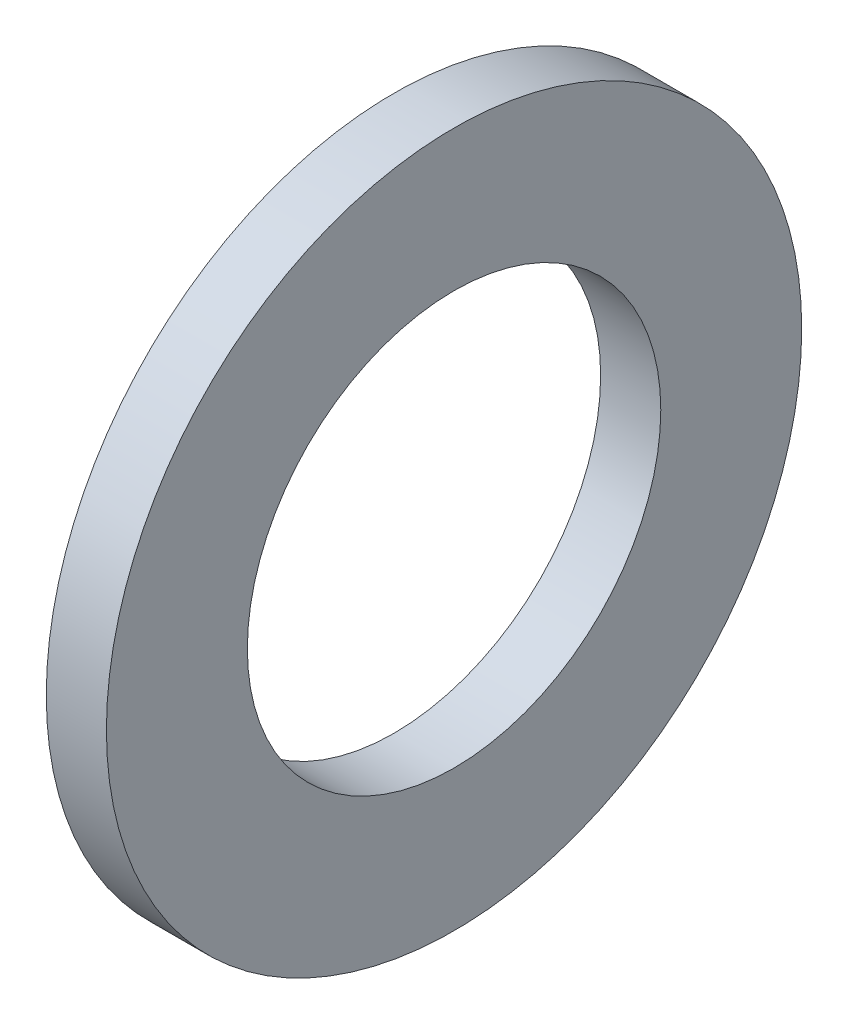
ISO-10303-21;
HEADER;
FILE_DESCRIPTION(('STEP AP214'),'2;1');
FILE_NAME('part.step','',(''),(''),'','','');
FILE_SCHEMA(('AUTOMOTIVE_DESIGN { 1 0 10303 214 1 1 1 1 }'));
ENDSEC;
DATA;
#1=APPLICATION_CONTEXT('core data for automotive mechanical design processes');
#2=APPLICATION_PROTOCOL_DEFINITION('international standard','automotive_design',2000,#1);
#3=PRODUCT_CONTEXT('',#1,'mechanical');
#4=PRODUCT('Part','Part','',(#3));
#5=PRODUCT_RELATED_PRODUCT_CATEGORY('part','',(#4));
#6=PRODUCT_DEFINITION_FORMATION('','',#4);
#7=PRODUCT_DEFINITION_CONTEXT('part definition',#1,'design');
#8=PRODUCT_DEFINITION('design','',#6,#7);
#9=PRODUCT_DEFINITION_SHAPE('','',#8);
#10=(LENGTH_UNIT() NAMED_UNIT(*) SI_UNIT(.MILLI.,.METRE.));
#11=(NAMED_UNIT(*) PLANE_ANGLE_UNIT() SI_UNIT($,.RADIAN.));
#12=(NAMED_UNIT(*) SI_UNIT($,.STERADIAN.) SOLID_ANGLE_UNIT());
#13=UNCERTAINTY_MEASURE_WITH_UNIT(LENGTH_MEASURE(1.E-05),#10,'distance_accuracy_value','');
#14=(GEOMETRIC_REPRESENTATION_CONTEXT(3) GLOBAL_UNCERTAINTY_ASSIGNED_CONTEXT((#13)) GLOBAL_UNIT_ASSIGNED_CONTEXT((#10,
#11,#12)) REPRESENTATION_CONTEXT('',''));
#15=CARTESIAN_POINT('',(0.,0.,0.));
#16=DIRECTION('',(0.,0.,1.));
#17=DIRECTION('',(1.,0.,0.));
#18=AXIS2_PLACEMENT_3D('',#15,#16,#17);
#19=CARTESIAN_POINT('',(-34.9249999999999,0.,0.));
#20=DIRECTION('',(-1.,0.,0.));
#21=DIRECTION('',(0.,0.,1.));
#22=AXIS2_PLACEMENT_3D('',#19,#20,#21);
#23=CYLINDRICAL_SURFACE('',#22,11.);
#24=CARTESIAN_POINT('',(0.,0.,0.));
#25=DIRECTION('',(-1.,0.,0.));
#26=DIRECTION('',(0.,0.,1.));
#27=AXIS2_PLACEMENT_3D('',#24,#25,#26);
#28=CIRCLE('',#27,11.);
#29=CARTESIAN_POINT('',(0.,0.,11.));
#30=VERTEX_POINT('',#29);
#31=EDGE_CURVE('E10',#30,#30,#28,.T.);
#32=ORIENTED_EDGE('',*,*,#31,.F.);
#33=EDGE_LOOP('',(#32));
#34=FACE_BOUND('',#33,.T.);
#35=CARTESIAN_POINT('',(-3.2,0.,0.));
#36=DIRECTION('',(-1.,0.,0.));
#37=DIRECTION('',(0.,0.,1.));
#38=AXIS2_PLACEMENT_3D('',#35,#36,#37);
#39=CIRCLE('',#38,11.);
#40=CARTESIAN_POINT('',(-3.2,0.,11.));
#41=VERTEX_POINT('',#40);
#42=EDGE_CURVE('E44',#41,#41,#39,.T.);
#43=ORIENTED_EDGE('',*,*,#42,.T.);
#44=EDGE_LOOP('',(#43));
#45=FACE_BOUND('',#44,.T.);
#46=ADVANCED_FACE('F30',(#34,#45),#23,.F.);
#47=CARTESIAN_POINT('',(0.,11.,0.));
#48=DIRECTION('',(-1.,0.,0.));
#49=DIRECTION('',(0.,0.,1.));
#50=AXIS2_PLACEMENT_3D('',#47,#48,#49);
#51=PLANE('',#50);
#52=CARTESIAN_POINT('',(0.,0.,0.));
#53=DIRECTION('',(-1.,0.,0.));
#54=DIRECTION('',(0.,0.,1.));
#55=AXIS2_PLACEMENT_3D('',#52,#53,#54);
#56=CIRCLE('',#55,18.5);
#57=CARTESIAN_POINT('',(0.,0.,18.5));
#58=VERTEX_POINT('',#57);
#59=EDGE_CURVE('E36',#58,#58,#56,.T.);
#60=ORIENTED_EDGE('',*,*,#59,.F.);
#61=EDGE_LOOP('',(#60));
#62=FACE_BOUND('',#61,.T.);
#63=ORIENTED_EDGE('',*,*,#31,.T.);
#64=EDGE_LOOP('',(#63));
#65=FACE_BOUND('',#64,.T.);
#66=ADVANCED_FACE('F59',(#62,#65),#51,.F.);
#67=CARTESIAN_POINT('',(-34.9249999999999,0.,0.));
#68=DIRECTION('',(-1.,0.,0.));
#69=DIRECTION('',(0.,0.,1.));
#70=AXIS2_PLACEMENT_3D('',#67,#68,#69);
#71=CYLINDRICAL_SURFACE('',#70,18.5);
#72=CARTESIAN_POINT('',(-3.2,0.,0.));
#73=DIRECTION('',(-1.,0.,0.));
#74=DIRECTION('',(0.,0.,1.));
#75=AXIS2_PLACEMENT_3D('',#72,#73,#74);
#76=CIRCLE('',#75,18.5);
#77=CARTESIAN_POINT('',(-3.2,0.,18.5));
#78=VERTEX_POINT('',#77);
#79=EDGE_CURVE('E40',#78,#78,#76,.T.);
#80=ORIENTED_EDGE('',*,*,#79,.F.);
#81=EDGE_LOOP('',(#80));
#82=FACE_BOUND('',#81,.T.);
#83=ORIENTED_EDGE('',*,*,#59,.T.);
#84=EDGE_LOOP('',(#83));
#85=FACE_BOUND('',#84,.T.);
#86=ADVANCED_FACE('F54',(#82,#85),#71,.T.);
#87=CARTESIAN_POINT('',(-3.2,18.5,0.));
#88=DIRECTION('',(1.,0.,0.));
#89=DIRECTION('',(0.,0.,-1.));
#90=AXIS2_PLACEMENT_3D('',#87,#88,#89);
#91=PLANE('',#90);
#92=ORIENTED_EDGE('',*,*,#42,.F.);
#93=EDGE_LOOP('',(#92));
#94=FACE_BOUND('',#93,.T.);
#95=ORIENTED_EDGE('',*,*,#79,.T.);
#96=EDGE_LOOP('',(#95));
#97=FACE_BOUND('',#96,.T.);
#98=ADVANCED_FACE('F51',(#94,#97),#91,.F.);
#99=CLOSED_SHELL('',(#46,#66,#86,#98));
#100=MANIFOLD_SOLID_BREP('B2',#99);
#101=ADVANCED_BREP_SHAPE_REPRESENTATION('',(#18,#100),#14);
#102=SHAPE_DEFINITION_REPRESENTATION(#9,#101);
ENDSEC;
END-ISO-10303-21;
